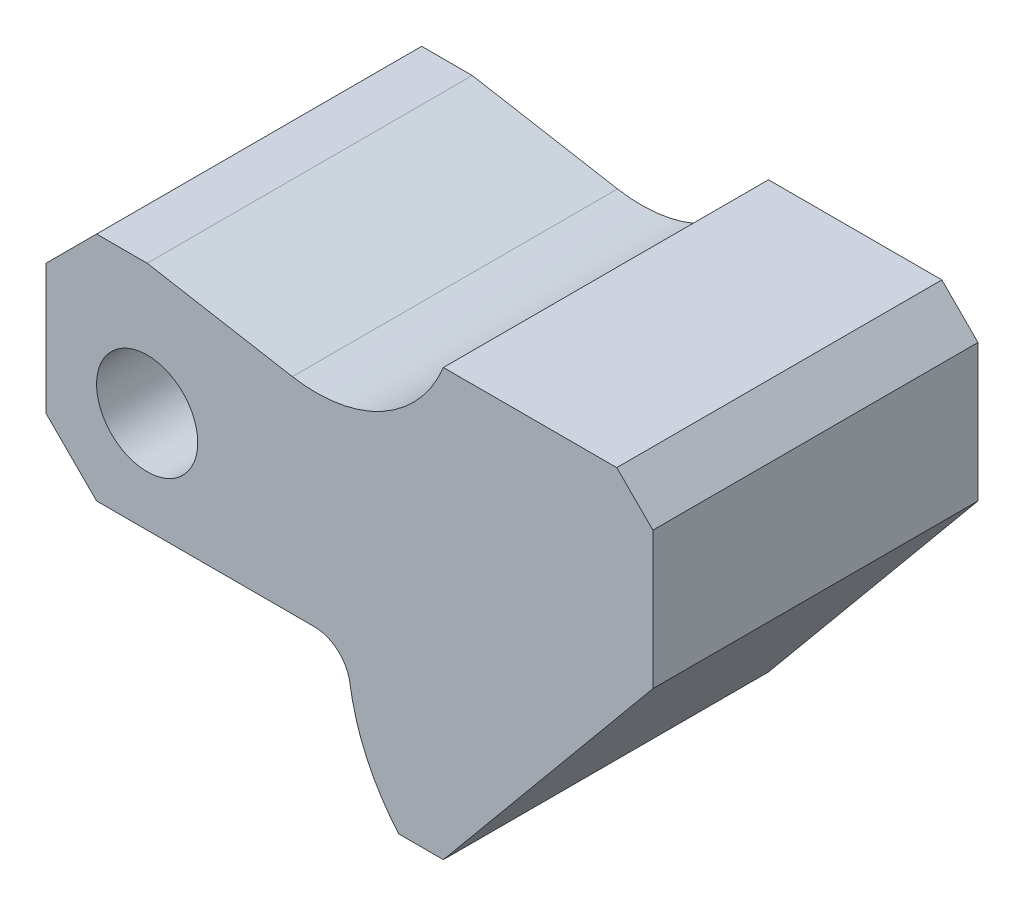
ISO-10303-21;
HEADER;
FILE_DESCRIPTION(('STEP AP214'),'2;1');
FILE_NAME('part.step','',(''),(''),'','','');
FILE_SCHEMA(('AUTOMOTIVE_DESIGN { 1 0 10303 214 1 1 1 1 }'));
ENDSEC;
DATA;
#1=APPLICATION_CONTEXT('core data for automotive mechanical design processes');
#2=APPLICATION_PROTOCOL_DEFINITION('international standard','automotive_design',2000,#1);
#3=PRODUCT_CONTEXT('',#1,'mechanical');
#4=PRODUCT('Part','Part','',(#3));
#5=PRODUCT_RELATED_PRODUCT_CATEGORY('part','',(#4));
#6=PRODUCT_DEFINITION_FORMATION('','',#4);
#7=PRODUCT_DEFINITION_CONTEXT('part definition',#1,'design');
#8=PRODUCT_DEFINITION('design','',#6,#7);
#9=PRODUCT_DEFINITION_SHAPE('','',#8);
#10=(LENGTH_UNIT() NAMED_UNIT(*) SI_UNIT(.MILLI.,.METRE.));
#11=(NAMED_UNIT(*) PLANE_ANGLE_UNIT() SI_UNIT($,.RADIAN.));
#12=(NAMED_UNIT(*) SI_UNIT($,.STERADIAN.) SOLID_ANGLE_UNIT());
#13=UNCERTAINTY_MEASURE_WITH_UNIT(LENGTH_MEASURE(1.E-05),#10,'distance_accuracy_value','');
#14=(GEOMETRIC_REPRESENTATION_CONTEXT(3) GLOBAL_UNCERTAINTY_ASSIGNED_CONTEXT((#13)) GLOBAL_UNIT_ASSIGNED_CONTEXT((#10,
#11,#12)) REPRESENTATION_CONTEXT('',''));
#15=CARTESIAN_POINT('',(0.,0.,0.));
#16=DIRECTION('',(0.,0.,1.));
#17=DIRECTION('',(1.,0.,0.));
#18=AXIS2_PLACEMENT_3D('',#15,#16,#17);
#19=CARTESIAN_POINT('',(21.9089023002066,19.,22.5));
#20=DIRECTION('',(0.,0.,-1.));
#21=DIRECTION('',(-1.,0.,0.));
#22=AXIS2_PLACEMENT_3D('',#19,#20,#21);
#23=CYLINDRICAL_SURFACE('',#22,29.);
#24=CARTESIAN_POINT('',(21.9089023002066,19.,-22.5));
#25=DIRECTION('',(0.,0.,1.));
#26=DIRECTION('',(1.,0.,0.));
#27=AXIS2_PLACEMENT_3D('',#24,#25,#26);
#28=CIRCLE('',#27,29.);
#29=CARTESIAN_POINT('',(-6.77580239998199,14.7352941176471,-22.5));
#30=VERTEX_POINT('',#29);
#31=CARTESIAN_POINT('',(0.,0.,-22.5));
#32=VERTEX_POINT('',#31);
#33=EDGE_CURVE('E166',#30,#32,#28,.T.);
#34=ORIENTED_EDGE('',*,*,#33,.T.);
#35=DIRECTION('',(0.,0.,-1.));
#36=VECTOR('',#35,1.);
#37=CARTESIAN_POINT('',(0.,0.,22.5));
#38=LINE('',#37,#36);
#39=CARTESIAN_POINT('',(0.,0.,22.5));
#40=VERTEX_POINT('',#39);
#41=EDGE_CURVE('E11',#40,#32,#38,.T.);
#42=ORIENTED_EDGE('',*,*,#41,.F.);
#43=CARTESIAN_POINT('',(21.9089023002066,19.,22.5));
#44=DIRECTION('',(0.,0.,1.));
#45=DIRECTION('',(1.,0.,0.));
#46=AXIS2_PLACEMENT_3D('',#43,#44,#45);
#47=CIRCLE('',#46,29.);
#48=CARTESIAN_POINT('',(-6.77580239998199,14.7352941176471,22.5));
#49=VERTEX_POINT('',#48);
#50=EDGE_CURVE('E193',#49,#40,#47,.T.);
#51=ORIENTED_EDGE('',*,*,#50,.F.);
#52=DIRECTION('',(0.,0.,-1.));
#53=VECTOR('',#52,1.);
#54=CARTESIAN_POINT('',(-6.77580239998199,14.7352941176471,22.5));
#55=LINE('',#54,#53);
#56=EDGE_CURVE('E162',#49,#30,#55,.T.);
#57=ORIENTED_EDGE('',*,*,#56,.T.);
#58=EDGE_LOOP('',(#34,#42,#51,#57));
#59=FACE_BOUND('',#58,.T.);
#60=ADVANCED_FACE('F34',(#59),#23,.T.);
#61=CARTESIAN_POINT('',(0.,0.,22.5));
#62=DIRECTION('',(0.,1.,0.));
#63=DIRECTION('',(0.,0.,1.));
#64=AXIS2_PLACEMENT_3D('',#61,#62,#63);
#65=PLANE('',#64);
#66=DIRECTION('',(1.,0.,0.));
#67=VECTOR('',#66,1.);
#68=CARTESIAN_POINT('',(0.,0.,-22.5));
#69=LINE('',#68,#67);
#70=CARTESIAN_POINT('',(6.1660451573495,0.,-22.5));
#71=VERTEX_POINT('',#70);
#72=EDGE_CURVE('E169',#32,#71,#69,.T.);
#73=ORIENTED_EDGE('',*,*,#72,.T.);
#74=DIRECTION('',(0.,0.,-1.));
#75=VECTOR('',#74,1.);
#76=CARTESIAN_POINT('',(6.1660451573495,0.,22.5));
#77=LINE('',#76,#75);
#78=CARTESIAN_POINT('',(6.1660451573495,0.,22.5));
#79=VERTEX_POINT('',#78);
#80=EDGE_CURVE('E42',#79,#71,#77,.T.);
#81=ORIENTED_EDGE('',*,*,#80,.F.);
#82=DIRECTION('',(1.,0.,0.));
#83=VECTOR('',#82,1.);
#84=CARTESIAN_POINT('',(0.,0.,22.5));
#85=LINE('',#84,#83);
#86=EDGE_CURVE('E111',#40,#79,#85,.T.);
#87=ORIENTED_EDGE('',*,*,#86,.F.);
#88=ORIENTED_EDGE('',*,*,#41,.T.);
#89=EDGE_LOOP('',(#73,#81,#87,#88));
#90=FACE_BOUND('',#89,.T.);
#91=ADVANCED_FACE('F282',(#90),#65,.F.);
#92=CARTESIAN_POINT('',(6.1660451573495,0.,22.5));
#93=DIRECTION('',(-0.770021560905562,0.638017864750323,0.));
#94=DIRECTION('',(-0.638017864750323,-0.770021560905562,0.));
#95=AXIS2_PLACEMENT_3D('',#92,#93,#94);
#96=PLANE('',#95);
#97=DIRECTION('',(0.638017864750323,0.770021560905562,0.));
#98=VECTOR('',#97,1.);
#99=CARTESIAN_POINT('',(6.1660451573495,0.,-22.5));
#100=LINE('',#99,#98);
#101=CARTESIAN_POINT('',(35.1660451573495,35.,-22.5));
#102=VERTEX_POINT('',#101);
#103=EDGE_CURVE('E172',#71,#102,#100,.T.);
#104=ORIENTED_EDGE('',*,*,#103,.T.);
#105=DIRECTION('',(0.,0.,-1.));
#106=VECTOR('',#105,1.);
#107=CARTESIAN_POINT('',(35.1660451573495,35.,22.5));
#108=LINE('',#107,#106);
#109=CARTESIAN_POINT('',(35.1660451573495,35.,22.5));
#110=VERTEX_POINT('',#109);
#111=EDGE_CURVE('E218',#110,#102,#108,.T.);
#112=ORIENTED_EDGE('',*,*,#111,.F.);
#113=DIRECTION('',(0.638017864750323,0.770021560905562,0.));
#114=VECTOR('',#113,1.);
#115=CARTESIAN_POINT('',(6.1660451573495,0.,22.5));
#116=LINE('',#115,#114);
#117=EDGE_CURVE('E226',#79,#110,#116,.T.);
#118=ORIENTED_EDGE('',*,*,#117,.F.);
#119=ORIENTED_EDGE('',*,*,#80,.T.);
#120=EDGE_LOOP('',(#104,#112,#118,#119));
#121=FACE_BOUND('',#120,.T.);
#122=ADVANCED_FACE('F224',(#121),#96,.F.);
#123=CARTESIAN_POINT('',(35.1660451573495,35.,22.5));
#124=DIRECTION('',(-1.,0.,0.));
#125=DIRECTION('',(0.,0.,1.));
#126=AXIS2_PLACEMENT_3D('',#123,#124,#125);
#127=PLANE('',#126);
#128=DIRECTION('',(0.,1.,0.));
#129=VECTOR('',#128,1.);
#130=CARTESIAN_POINT('',(35.1660451573495,35.,-22.5));
#131=LINE('',#130,#129);
#132=CARTESIAN_POINT('',(35.1660451573495,54.,-22.5));
#133=VERTEX_POINT('',#132);
#134=EDGE_CURVE('E174',#102,#133,#131,.T.);
#135=ORIENTED_EDGE('',*,*,#134,.T.);
#136=DIRECTION('',(0.,0.,-1.));
#137=VECTOR('',#136,1.);
#138=CARTESIAN_POINT('',(35.1660451573495,54.,22.5));
#139=LINE('',#138,#137);
#140=CARTESIAN_POINT('',(35.1660451573495,54.,22.5));
#141=VERTEX_POINT('',#140);
#142=EDGE_CURVE('E215',#141,#133,#139,.T.);
#143=ORIENTED_EDGE('',*,*,#142,.F.);
#144=DIRECTION('',(0.,1.,0.));
#145=VECTOR('',#144,1.);
#146=CARTESIAN_POINT('',(35.1660451573495,35.,22.5));
#147=LINE('',#146,#145);
#148=EDGE_CURVE('E244',#110,#141,#147,.T.);
#149=ORIENTED_EDGE('',*,*,#148,.F.);
#150=ORIENTED_EDGE('',*,*,#111,.T.);
#151=EDGE_LOOP('',(#135,#143,#149,#150));
#152=FACE_BOUND('',#151,.T.);
#153=ADVANCED_FACE('F235',(#152),#127,.F.);
#154=CARTESIAN_POINT('',(35.1660451573495,54.,22.5));
#155=DIRECTION('',(-0.707106781186546,-0.707106781186549,0.));
#156=DIRECTION('',(0.707106781186549,-0.707106781186546,0.));
#157=AXIS2_PLACEMENT_3D('',#154,#155,#156);
#158=PLANE('',#157);
#159=DIRECTION('',(-0.707106781186549,0.707106781186546,0.));
#160=VECTOR('',#159,1.);
#161=CARTESIAN_POINT('',(35.1660451573495,54.,-22.5));
#162=LINE('',#161,#160);
#163=CARTESIAN_POINT('',(30.1660451573495,59.,-22.5));
#164=VERTEX_POINT('',#163);
#165=EDGE_CURVE('E176',#133,#164,#162,.T.);
#166=ORIENTED_EDGE('',*,*,#165,.T.);
#167=DIRECTION('',(0.,0.,-1.));
#168=VECTOR('',#167,1.);
#169=CARTESIAN_POINT('',(30.1660451573495,59.,22.5));
#170=LINE('',#169,#168);
#171=CARTESIAN_POINT('',(30.1660451573495,59.,22.5));
#172=VERTEX_POINT('',#171);
#173=EDGE_CURVE('E212',#172,#164,#170,.T.);
#174=ORIENTED_EDGE('',*,*,#173,.F.);
#175=DIRECTION('',(-0.707106781186549,0.707106781186546,0.));
#176=VECTOR('',#175,1.);
#177=CARTESIAN_POINT('',(35.1660451573495,54.,22.5));
#178=LINE('',#177,#176);
#179=EDGE_CURVE('E241',#141,#172,#178,.T.);
#180=ORIENTED_EDGE('',*,*,#179,.F.);
#181=ORIENTED_EDGE('',*,*,#142,.T.);
#182=EDGE_LOOP('',(#166,#174,#180,#181));
#183=FACE_BOUND('',#182,.T.);
#184=ADVANCED_FACE('F239',(#183),#158,.F.);
#185=CARTESIAN_POINT('',(30.1660451573495,59.,22.5));
#186=DIRECTION('',(0.,-1.,0.));
#187=DIRECTION('',(0.,0.,-1.));
#188=AXIS2_PLACEMENT_3D('',#185,#186,#187);
#189=PLANE('',#188);
#190=DIRECTION('',(-1.,0.,0.));
#191=VECTOR('',#190,1.);
#192=CARTESIAN_POINT('',(30.1660451573495,59.,-22.5));
#193=LINE('',#192,#191);
#194=CARTESIAN_POINT('',(6.1660451573495,59.,-22.5));
#195=VERTEX_POINT('',#194);
#196=EDGE_CURVE('E178',#164,#195,#193,.T.);
#197=ORIENTED_EDGE('',*,*,#196,.T.);
#198=DIRECTION('',(0.,0.,-1.));
#199=VECTOR('',#198,1.);
#200=CARTESIAN_POINT('',(6.1660451573495,59.,22.5));
#201=LINE('',#200,#199);
#202=CARTESIAN_POINT('',(6.1660451573495,59.,22.5));
#203=VERTEX_POINT('',#202);
#204=EDGE_CURVE('E209',#203,#195,#201,.T.);
#205=ORIENTED_EDGE('',*,*,#204,.F.);
#206=DIRECTION('',(-1.,0.,0.));
#207=VECTOR('',#206,1.);
#208=CARTESIAN_POINT('',(30.1660451573495,59.,22.5));
#209=LINE('',#208,#207);
#210=EDGE_CURVE('E243',#172,#203,#209,.T.);
#211=ORIENTED_EDGE('',*,*,#210,.F.);
#212=ORIENTED_EDGE('',*,*,#173,.T.);
#213=EDGE_LOOP('',(#197,#205,#211,#212));
#214=FACE_BOUND('',#213,.T.);
#215=ADVANCED_FACE('F295',(#214),#189,.F.);
#216=CARTESIAN_POINT('',(-11.4305971149656,66.1664622192664,22.5));
#217=DIRECTION('',(0.,0.,-1.));
#218=DIRECTION('',(-1.,0.,0.));
#219=AXIS2_PLACEMENT_3D('',#216,#217,#218);
#220=CYLINDRICAL_SURFACE('',#219,19.);
#221=CARTESIAN_POINT('',(-11.4305971149656,66.1664622192664,-22.5));
#222=DIRECTION('',(0.,0.,-1.));
#223=DIRECTION('',(-1.,0.,0.));
#224=AXIS2_PLACEMENT_3D('',#221,#222,#223);
#225=CIRCLE('',#224,19.);
#226=CARTESIAN_POINT('',(-14.7299124906373,47.4551149120344,-22.5));
#227=VERTEX_POINT('',#226);
#228=EDGE_CURVE('E180',#195,#227,#225,.T.);
#229=ORIENTED_EDGE('',*,*,#228,.T.);
#230=DIRECTION('',(0.,0.,-1.));
#231=VECTOR('',#230,1.);
#232=CARTESIAN_POINT('',(-14.7299124906373,47.4551149120344,22.5));
#233=LINE('',#232,#231);
#234=CARTESIAN_POINT('',(-14.7299124906373,47.4551149120344,22.5));
#235=VERTEX_POINT('',#234);
#236=EDGE_CURVE('E206',#235,#227,#233,.T.);
#237=ORIENTED_EDGE('',*,*,#236,.F.);
#238=CARTESIAN_POINT('',(-11.4305971149656,66.1664622192664,22.5));
#239=DIRECTION('',(0.,0.,-1.));
#240=DIRECTION('',(-1.,0.,0.));
#241=AXIS2_PLACEMENT_3D('',#238,#239,#240);
#242=CIRCLE('',#241,19.);
#243=EDGE_CURVE('E246',#203,#235,#242,.T.);
#244=ORIENTED_EDGE('',*,*,#243,.F.);
#245=ORIENTED_EDGE('',*,*,#204,.T.);
#246=EDGE_LOOP('',(#229,#237,#244,#245));
#247=FACE_BOUND('',#246,.T.);
#248=ADVANCED_FACE('F298',(#247),#220,.F.);
#249=CARTESIAN_POINT('',(-14.7299124906373,47.4551149120344,22.5));
#250=DIRECTION('',(-0.173648177666931,-0.984807753012208,0.));
#251=DIRECTION('',(0.984807753012208,-0.173648177666931,0.));
#252=AXIS2_PLACEMENT_3D('',#249,#250,#251);
#253=PLANE('',#252);
#254=DIRECTION('',(-0.984807753012208,0.173648177666931,0.));
#255=VECTOR('',#254,1.);
#256=CARTESIAN_POINT('',(-14.7299124906373,47.4551149120344,-22.5));
#257=LINE('',#256,#255);
#258=CARTESIAN_POINT('',(-34.8339548426505,51.,-22.5));
#259=VERTEX_POINT('',#258);
#260=EDGE_CURVE('E182',#227,#259,#257,.T.);
#261=ORIENTED_EDGE('',*,*,#260,.T.);
#262=DIRECTION('',(0.,0.,-1.));
#263=VECTOR('',#262,1.);
#264=CARTESIAN_POINT('',(-34.8339548426505,51.,22.5));
#265=LINE('',#264,#263);
#266=CARTESIAN_POINT('',(-34.8339548426505,51.,22.5));
#267=VERTEX_POINT('',#266);
#268=EDGE_CURVE('E203',#267,#259,#265,.T.);
#269=ORIENTED_EDGE('',*,*,#268,.F.);
#270=DIRECTION('',(-0.984807753012208,0.173648177666931,0.));
#271=VECTOR('',#270,1.);
#272=CARTESIAN_POINT('',(-14.7299124906373,47.4551149120344,22.5));
#273=LINE('',#272,#271);
#274=EDGE_CURVE('E252',#235,#267,#273,.T.);
#275=ORIENTED_EDGE('',*,*,#274,.F.);
#276=ORIENTED_EDGE('',*,*,#236,.T.);
#277=EDGE_LOOP('',(#261,#269,#275,#276));
#278=FACE_BOUND('',#277,.T.);
#279=ADVANCED_FACE('F302',(#278),#253,.F.);
#280=CARTESIAN_POINT('',(-34.8339548426505,51.,22.5));
#281=DIRECTION('',(0.,-1.,0.));
#282=DIRECTION('',(0.,0.,-1.));
#283=AXIS2_PLACEMENT_3D('',#280,#281,#282);
#284=PLANE('',#283);
#285=DIRECTION('',(-1.,0.,0.));
#286=VECTOR('',#285,1.);
#287=CARTESIAN_POINT('',(-34.8339548426505,51.,-22.5));
#288=LINE('',#287,#286);
#289=CARTESIAN_POINT('',(-41.8339548426505,51.,-22.5));
#290=VERTEX_POINT('',#289);
#291=EDGE_CURVE('E184',#259,#290,#288,.T.);
#292=ORIENTED_EDGE('',*,*,#291,.T.);
#293=DIRECTION('',(0.,0.,-1.));
#294=VECTOR('',#293,1.);
#295=CARTESIAN_POINT('',(-41.8339548426505,51.,22.5));
#296=LINE('',#295,#294);
#297=CARTESIAN_POINT('',(-41.8339548426505,51.,22.5));
#298=VERTEX_POINT('',#297);
#299=EDGE_CURVE('E200',#298,#290,#296,.T.);
#300=ORIENTED_EDGE('',*,*,#299,.F.);
#301=DIRECTION('',(-1.,0.,0.));
#302=VECTOR('',#301,1.);
#303=CARTESIAN_POINT('',(-34.8339548426505,51.,22.5));
#304=LINE('',#303,#302);
#305=EDGE_CURVE('E254',#267,#298,#304,.T.);
#306=ORIENTED_EDGE('',*,*,#305,.F.);
#307=ORIENTED_EDGE('',*,*,#268,.T.);
#308=EDGE_LOOP('',(#292,#300,#306,#307));
#309=FACE_BOUND('',#308,.T.);
#310=ADVANCED_FACE('F306',(#309),#284,.F.);
#311=CARTESIAN_POINT('',(-41.8339548426505,51.,22.5));
#312=DIRECTION('',(0.707106781186546,-0.707106781186549,0.));
#313=DIRECTION('',(0.707106781186549,0.707106781186546,0.));
#314=AXIS2_PLACEMENT_3D('',#311,#312,#313);
#315=PLANE('',#314);
#316=DIRECTION('',(-0.707106781186549,-0.707106781186546,0.));
#317=VECTOR('',#316,1.);
#318=CARTESIAN_POINT('',(-41.8339548426505,51.,-22.5));
#319=LINE('',#318,#317);
#320=CARTESIAN_POINT('',(-48.8339548426505,44.,-22.5));
#321=VERTEX_POINT('',#320);
#322=EDGE_CURVE('E186',#290,#321,#319,.T.);
#323=ORIENTED_EDGE('',*,*,#322,.T.);
#324=DIRECTION('',(0.,0.,-1.));
#325=VECTOR('',#324,1.);
#326=CARTESIAN_POINT('',(-48.8339548426505,44.,22.5));
#327=LINE('',#326,#325);
#328=CARTESIAN_POINT('',(-48.8339548426505,44.,22.5));
#329=VERTEX_POINT('',#328);
#330=EDGE_CURVE('E197',#329,#321,#327,.T.);
#331=ORIENTED_EDGE('',*,*,#330,.F.);
#332=DIRECTION('',(-0.707106781186549,-0.707106781186546,0.));
#333=VECTOR('',#332,1.);
#334=CARTESIAN_POINT('',(-41.8339548426505,51.,22.5));
#335=LINE('',#334,#333);
#336=EDGE_CURVE('E256',#298,#329,#335,.T.);
#337=ORIENTED_EDGE('',*,*,#336,.F.);
#338=ORIENTED_EDGE('',*,*,#299,.T.);
#339=EDGE_LOOP('',(#323,#331,#337,#338));
#340=FACE_BOUND('',#339,.T.);
#341=ADVANCED_FACE('F262',(#340),#315,.F.);
#342=CARTESIAN_POINT('',(-48.8339548426505,44.,22.5));
#343=DIRECTION('',(1.,0.,0.));
#344=DIRECTION('',(0.,0.,-1.));
#345=AXIS2_PLACEMENT_3D('',#342,#343,#344);
#346=PLANE('',#345);
#347=DIRECTION('',(0.,-1.,0.));
#348=VECTOR('',#347,1.);
#349=CARTESIAN_POINT('',(-48.8339548426505,44.,-22.5));
#350=LINE('',#349,#348);
#351=CARTESIAN_POINT('',(-48.8339548426505,26.,-22.5));
#352=VERTEX_POINT('',#351);
#353=EDGE_CURVE('E188',#321,#352,#350,.T.);
#354=ORIENTED_EDGE('',*,*,#353,.T.);
#355=DIRECTION('',(0.,0.,-1.));
#356=VECTOR('',#355,1.);
#357=CARTESIAN_POINT('',(-48.8339548426505,26.,22.5));
#358=LINE('',#357,#356);
#359=CARTESIAN_POINT('',(-48.8339548426505,26.,22.5));
#360=VERTEX_POINT('',#359);
#361=EDGE_CURVE('E157',#360,#352,#358,.T.);
#362=ORIENTED_EDGE('',*,*,#361,.F.);
#363=DIRECTION('',(0.,-1.,0.));
#364=VECTOR('',#363,1.);
#365=CARTESIAN_POINT('',(-48.8339548426505,44.,22.5));
#366=LINE('',#365,#364);
#367=EDGE_CURVE('E148',#329,#360,#366,.T.);
#368=ORIENTED_EDGE('',*,*,#367,.F.);
#369=ORIENTED_EDGE('',*,*,#330,.T.);
#370=EDGE_LOOP('',(#354,#362,#368,#369));
#371=FACE_BOUND('',#370,.T.);
#372=ADVANCED_FACE('F266',(#371),#346,.F.);
#373=CARTESIAN_POINT('',(-48.8339548426505,26.,22.5));
#374=DIRECTION('',(0.707106781186549,0.707106781186546,0.));
#375=DIRECTION('',(-0.707106781186546,0.707106781186549,0.));
#376=AXIS2_PLACEMENT_3D('',#373,#374,#375);
#377=PLANE('',#376);
#378=DIRECTION('',(0.707106781186546,-0.707106781186549,0.));
#379=VECTOR('',#378,1.);
#380=CARTESIAN_POINT('',(-48.8339548426505,26.,-22.5));
#381=LINE('',#380,#379);
#382=CARTESIAN_POINT('',(-41.8339548426505,19.,-22.5));
#383=VERTEX_POINT('',#382);
#384=EDGE_CURVE('E156',#352,#383,#381,.T.);
#385=ORIENTED_EDGE('',*,*,#384,.T.);
#386=DIRECTION('',(0.,0.,-1.));
#387=VECTOR('',#386,1.);
#388=CARTESIAN_POINT('',(-41.8339548426505,19.,22.5));
#389=LINE('',#388,#387);
#390=CARTESIAN_POINT('',(-41.8339548426505,19.,22.5));
#391=VERTEX_POINT('',#390);
#392=EDGE_CURVE('E153',#391,#383,#389,.T.);
#393=ORIENTED_EDGE('',*,*,#392,.F.);
#394=DIRECTION('',(0.707106781186546,-0.707106781186549,0.));
#395=VECTOR('',#394,1.);
#396=CARTESIAN_POINT('',(-48.8339548426505,26.,22.5));
#397=LINE('',#396,#395);
#398=EDGE_CURVE('E142',#360,#391,#397,.T.);
#399=ORIENTED_EDGE('',*,*,#398,.F.);
#400=ORIENTED_EDGE('',*,*,#361,.T.);
#401=EDGE_LOOP('',(#385,#393,#399,#400));
#402=FACE_BOUND('',#401,.T.);
#403=ADVANCED_FACE('F154',(#402),#377,.F.);
#404=CARTESIAN_POINT('',(-41.8339548426505,19.,22.5));
#405=DIRECTION('',(0.,1.,0.));
#406=DIRECTION('',(0.,0.,1.));
#407=AXIS2_PLACEMENT_3D('',#404,#405,#406);
#408=PLANE('',#407);
#409=DIRECTION('',(1.,0.,0.));
#410=VECTOR('',#409,1.);
#411=CARTESIAN_POINT('',(-41.8339548426505,19.,-22.5));
#412=LINE('',#411,#410);
#413=CARTESIAN_POINT('',(-11.7214411413938,19.,-22.5));
#414=VERTEX_POINT('',#413);
#415=EDGE_CURVE('E97',#383,#414,#412,.T.);
#416=ORIENTED_EDGE('',*,*,#415,.T.);
#417=DIRECTION('',(0.,0.,-1.));
#418=VECTOR('',#417,1.);
#419=CARTESIAN_POINT('',(-11.7214411413938,19.,22.5));
#420=LINE('',#419,#418);
#421=CARTESIAN_POINT('',(-11.7214411413938,19.,22.5));
#422=VERTEX_POINT('',#421);
#423=EDGE_CURVE('E158',#422,#414,#420,.T.);
#424=ORIENTED_EDGE('',*,*,#423,.F.);
#425=DIRECTION('',(1.,0.,0.));
#426=VECTOR('',#425,1.);
#427=CARTESIAN_POINT('',(-41.8339548426505,19.,22.5));
#428=LINE('',#427,#426);
#429=EDGE_CURVE('E146',#391,#422,#428,.T.);
#430=ORIENTED_EDGE('',*,*,#429,.F.);
#431=ORIENTED_EDGE('',*,*,#392,.T.);
#432=EDGE_LOOP('',(#416,#424,#430,#431));
#433=FACE_BOUND('',#432,.T.);
#434=ADVANCED_FACE('F160',(#433),#408,.F.);
#435=CARTESIAN_POINT('',(-11.7214411413938,14.,22.5));
#436=DIRECTION('',(0.,0.,-1.));
#437=DIRECTION('',(-1.,0.,0.));
#438=AXIS2_PLACEMENT_3D('',#435,#436,#437);
#439=CYLINDRICAL_SURFACE('',#438,5.);
#440=CARTESIAN_POINT('',(-11.7214411413938,14.,-22.5));
#441=DIRECTION('',(0.,0.,-1.));
#442=DIRECTION('',(-1.,0.,0.));
#443=AXIS2_PLACEMENT_3D('',#440,#441,#442);
#444=CIRCLE('',#443,5.);
#445=EDGE_CURVE('E103',#414,#30,#444,.T.);
#446=ORIENTED_EDGE('',*,*,#445,.T.);
#447=ORIENTED_EDGE('',*,*,#56,.F.);
#448=CARTESIAN_POINT('',(-11.7214411413938,14.,22.5));
#449=DIRECTION('',(0.,0.,-1.));
#450=DIRECTION('',(-1.,0.,0.));
#451=AXIS2_PLACEMENT_3D('',#448,#449,#450);
#452=CIRCLE('',#451,5.);
#453=EDGE_CURVE('E50',#422,#49,#452,.T.);
#454=ORIENTED_EDGE('',*,*,#453,.F.);
#455=ORIENTED_EDGE('',*,*,#423,.T.);
#456=EDGE_LOOP('',(#446,#447,#454,#455));
#457=FACE_BOUND('',#456,.T.);
#458=ADVANCED_FACE('F270',(#457),#439,.F.);
#459=CARTESIAN_POINT('',(21.9089023002066,19.,22.5));
#460=DIRECTION('',(0.,0.,1.));
#461=DIRECTION('',(1.,0.,0.));
#462=AXIS2_PLACEMENT_3D('',#459,#460,#461);
#463=PLANE('',#462);
#464=CARTESIAN_POINT('',(-34.8339548426505,33.,22.5));
#465=DIRECTION('',(0.,0.,1.));
#466=DIRECTION('',(1.,0.,0.));
#467=AXIS2_PLACEMENT_3D('',#464,#465,#466);
#468=CIRCLE('',#467,7.);
#469=CARTESIAN_POINT('',(-27.8339548426505,33.,22.5));
#470=VERTEX_POINT('',#469);
#471=EDGE_CURVE('E361',#470,#470,#468,.T.);
#472=ORIENTED_EDGE('',*,*,#471,.F.);
#473=EDGE_LOOP('',(#472));
#474=FACE_BOUND('',#473,.T.);
#475=ORIENTED_EDGE('',*,*,#50,.T.);
#476=ORIENTED_EDGE('',*,*,#86,.T.);
#477=ORIENTED_EDGE('',*,*,#117,.T.);
#478=ORIENTED_EDGE('',*,*,#148,.T.);
#479=ORIENTED_EDGE('',*,*,#179,.T.);
#480=ORIENTED_EDGE('',*,*,#210,.T.);
#481=ORIENTED_EDGE('',*,*,#243,.T.);
#482=ORIENTED_EDGE('',*,*,#274,.T.);
#483=ORIENTED_EDGE('',*,*,#305,.T.);
#484=ORIENTED_EDGE('',*,*,#336,.T.);
#485=ORIENTED_EDGE('',*,*,#367,.T.);
#486=ORIENTED_EDGE('',*,*,#398,.T.);
#487=ORIENTED_EDGE('',*,*,#429,.T.);
#488=ORIENTED_EDGE('',*,*,#453,.T.);
#489=EDGE_LOOP('',(#475,#476,#477,#478,#479,#480,#481,#482,#483,#484,#485,#486,#487,#488));
#490=FACE_BOUND('',#489,.T.);
#491=ADVANCED_FACE('F144',(#474,#490),#463,.T.);
#492=CARTESIAN_POINT('',(21.9089023002066,19.,-22.5));
#493=DIRECTION('',(0.,0.,1.));
#494=DIRECTION('',(1.,0.,0.));
#495=AXIS2_PLACEMENT_3D('',#492,#493,#494);
#496=PLANE('',#495);
#497=CARTESIAN_POINT('',(-34.8339548426505,33.,-22.5));
#498=DIRECTION('',(0.,0.,1.));
#499=DIRECTION('',(1.,0.,0.));
#500=AXIS2_PLACEMENT_3D('',#497,#498,#499);
#501=CIRCLE('',#500,7.);
#502=CARTESIAN_POINT('',(-27.8339548426505,33.,-22.5));
#503=VERTEX_POINT('',#502);
#504=EDGE_CURVE('E170',#503,#503,#501,.T.);
#505=ORIENTED_EDGE('',*,*,#504,.T.);
#506=EDGE_LOOP('',(#505));
#507=FACE_BOUND('',#506,.T.);
#508=ORIENTED_EDGE('',*,*,#33,.F.);
#509=ORIENTED_EDGE('',*,*,#445,.F.);
#510=ORIENTED_EDGE('',*,*,#415,.F.);
#511=ORIENTED_EDGE('',*,*,#384,.F.);
#512=ORIENTED_EDGE('',*,*,#353,.F.);
#513=ORIENTED_EDGE('',*,*,#322,.F.);
#514=ORIENTED_EDGE('',*,*,#291,.F.);
#515=ORIENTED_EDGE('',*,*,#260,.F.);
#516=ORIENTED_EDGE('',*,*,#228,.F.);
#517=ORIENTED_EDGE('',*,*,#196,.F.);
#518=ORIENTED_EDGE('',*,*,#165,.F.);
#519=ORIENTED_EDGE('',*,*,#134,.F.);
#520=ORIENTED_EDGE('',*,*,#103,.F.);
#521=ORIENTED_EDGE('',*,*,#72,.F.);
#522=EDGE_LOOP('',(#508,#509,#510,#511,#512,#513,#514,#515,#516,#517,#518,#519,#520,#521));
#523=FACE_BOUND('',#522,.T.);
#524=ADVANCED_FACE('F230',(#507,#523),#496,.F.);
#525=CARTESIAN_POINT('',(-34.8339548426505,33.,-22.5));
#526=DIRECTION('',(0.,0.,1.));
#527=DIRECTION('',(1.,0.,0.));
#528=AXIS2_PLACEMENT_3D('',#525,#526,#527);
#529=CYLINDRICAL_SURFACE('',#528,7.);
#530=CARTESIAN_POINT('',(-27.8339548426505,33.,-22.5));
#531=CARTESIAN_POINT('',(-27.8339548426505,33.,-22.03125));
#532=CARTESIAN_POINT('',(-27.8339548426505,33.,-21.5625));
#533=CARTESIAN_POINT('',(-27.8339548426505,33.,-20.625));
#534=CARTESIAN_POINT('',(-27.8339548426505,33.,-20.15625));
#535=CARTESIAN_POINT('',(-27.8339548426505,33.,-19.21875));
#536=CARTESIAN_POINT('',(-27.8339548426505,33.,-18.75));
#537=CARTESIAN_POINT('',(-27.8339548426505,33.,-17.8125));
#538=CARTESIAN_POINT('',(-27.8339548426505,33.,-17.34375));
#539=CARTESIAN_POINT('',(-27.8339548426505,33.,-16.40625));
#540=CARTESIAN_POINT('',(-27.8339548426505,33.,-15.9375));
#541=CARTESIAN_POINT('',(-27.8339548426505,33.,-15.));
#542=CARTESIAN_POINT('',(-27.8339548426505,33.,-14.53125));
#543=CARTESIAN_POINT('',(-27.8339548426505,33.,-13.59375));
#544=CARTESIAN_POINT('',(-27.8339548426505,33.,-13.125));
#545=CARTESIAN_POINT('',(-27.8339548426505,33.,-12.1875));
#546=CARTESIAN_POINT('',(-27.8339548426505,33.,-11.71875));
#547=CARTESIAN_POINT('',(-27.8339548426505,33.,-10.78125));
#548=CARTESIAN_POINT('',(-27.8339548426505,33.,-10.3125));
#549=CARTESIAN_POINT('',(-27.8339548426505,33.,-9.375));
#550=CARTESIAN_POINT('',(-27.8339548426505,33.,-8.90625));
#551=CARTESIAN_POINT('',(-27.8339548426505,33.,-7.96875));
#552=CARTESIAN_POINT('',(-27.8339548426505,33.,-7.5));
#553=CARTESIAN_POINT('',(-27.8339548426505,33.,-6.5625));
#554=CARTESIAN_POINT('',(-27.8339548426505,33.,-6.09375));
#555=CARTESIAN_POINT('',(-27.8339548426505,33.,-5.15625));
#556=CARTESIAN_POINT('',(-27.8339548426505,33.,-4.6875));
#557=CARTESIAN_POINT('',(-27.8339548426505,33.,-3.75));
#558=CARTESIAN_POINT('',(-27.8339548426505,33.,-3.28125));
#559=CARTESIAN_POINT('',(-27.8339548426505,33.,-2.34375));
#560=CARTESIAN_POINT('',(-27.8339548426505,33.,-1.875));
#561=CARTESIAN_POINT('',(-27.8339548426505,33.,-0.937500000000004));
#562=CARTESIAN_POINT('',(-27.8339548426505,33.,-0.468750000000004));
#563=CARTESIAN_POINT('',(-27.8339548426505,33.,0.468749999999997));
#564=CARTESIAN_POINT('',(-27.8339548426505,33.,0.937499999999997));
#565=CARTESIAN_POINT('',(-27.8339548426505,33.,1.875));
#566=CARTESIAN_POINT('',(-27.8339548426505,33.,2.34375));
#567=CARTESIAN_POINT('',(-27.8339548426505,33.,3.28125));
#568=CARTESIAN_POINT('',(-27.8339548426505,33.,3.75));
#569=CARTESIAN_POINT('',(-27.8339548426505,33.,4.6875));
#570=CARTESIAN_POINT('',(-27.8339548426505,33.,5.15624999999999));
#571=CARTESIAN_POINT('',(-27.8339548426505,33.,6.09374999999999));
#572=CARTESIAN_POINT('',(-27.8339548426505,33.,6.5625));
#573=CARTESIAN_POINT('',(-27.8339548426505,33.,7.5));
#574=CARTESIAN_POINT('',(-27.8339548426505,33.,7.96875));
#575=CARTESIAN_POINT('',(-27.8339548426505,33.,8.90625));
#576=CARTESIAN_POINT('',(-27.8339548426505,33.,9.37499999999999));
#577=CARTESIAN_POINT('',(-27.8339548426505,33.,10.3125));
#578=CARTESIAN_POINT('',(-27.8339548426505,33.,10.78125));
#579=CARTESIAN_POINT('',(-27.8339548426505,33.,11.71875));
#580=CARTESIAN_POINT('',(-27.8339548426505,33.,12.1875));
#581=CARTESIAN_POINT('',(-27.8339548426505,33.,13.125));
#582=CARTESIAN_POINT('',(-27.8339548426505,33.,13.59375));
#583=CARTESIAN_POINT('',(-27.8339548426505,33.,14.53125));
#584=CARTESIAN_POINT('',(-27.8339548426505,33.,15.));
#585=CARTESIAN_POINT('',(-27.8339548426505,33.,15.9375));
#586=CARTESIAN_POINT('',(-27.8339548426505,33.,16.40625));
#587=CARTESIAN_POINT('',(-27.8339548426505,33.,17.34375));
#588=CARTESIAN_POINT('',(-27.8339548426505,33.,17.8125));
#589=CARTESIAN_POINT('',(-27.8339548426505,33.,18.75));
#590=CARTESIAN_POINT('',(-27.8339548426505,33.,19.21875));
#591=CARTESIAN_POINT('',(-27.8339548426505,33.,20.15625));
#592=CARTESIAN_POINT('',(-27.8339548426505,33.,20.625));
#593=CARTESIAN_POINT('',(-27.8339548426505,33.,21.5625));
#594=CARTESIAN_POINT('',(-27.8339548426505,33.,22.03125));
#595=CARTESIAN_POINT('',(-27.8339548426505,33.,22.5));
#596=B_SPLINE_CURVE_WITH_KNOTS('',3,(#530,#531,#532,#533,#534,#535,#536,#537,#538,#539,#540,
#541,#542,#543,#544,#545,#546,#547,#548,#549,#550,#551,#552,#553,#554,#555,#556,#557,#558,#559,
#560,#561,#562,#563,#564,#565,#566,#567,#568,#569,#570,#571,#572,#573,#574,#575,#576,#577,#578,
#579,#580,#581,#582,#583,#584,#585,#586,#587,#588,#589,#590,#591,#592,#593,#594,#595),
.UNSPECIFIED.,.F.,.F.,(4,2,2,2,2,2,2,2,2,2,2,2,2,2,2,2,2,2,2,2,2,2,2,2,2,2,2,2,2,2,2,2,4),(0.,
1.40625,2.8125,4.21875,5.625,7.03125,8.4375,9.84375,11.25,12.65625,14.0625,15.46875,16.875,
18.28125,19.6875,21.09375,22.5,23.90625,25.3125,26.71875,28.125,29.53125,30.9375,32.34375,33.75,
35.15625,36.5625,37.96875,39.375,40.78125,42.1875,43.59375,45.),.UNSPECIFIED.);
#597=EDGE_CURVE('BSEAM343',#503,#470,#596,.T.);
#598=ORIENTED_EDGE('',*,*,#504,.F.);
#599=ORIENTED_EDGE('',*,*,#471,.T.);
#600=ORIENTED_EDGE('',*,*,#597,.T.);
#601=ORIENTED_EDGE('',*,*,#597,.F.);
#602=EDGE_LOOP('',(#598,#600,#599,#601));
#603=FACE_BOUND('',#602,.T.);
#604=ADVANCED_FACE('F343',(#603),#529,.F.);
#605=CLOSED_SHELL('',(#60,#91,#122,#153,#184,#215,#248,#279,#310,#341,#372,#403,#434,#458,#491,
#524,#604));
#606=MANIFOLD_SOLID_BREP('B2',#605);
#607=ADVANCED_BREP_SHAPE_REPRESENTATION('',(#18,#606),#14);
#608=SHAPE_DEFINITION_REPRESENTATION(#9,#607);
ENDSEC;
END-ISO-10303-21;
